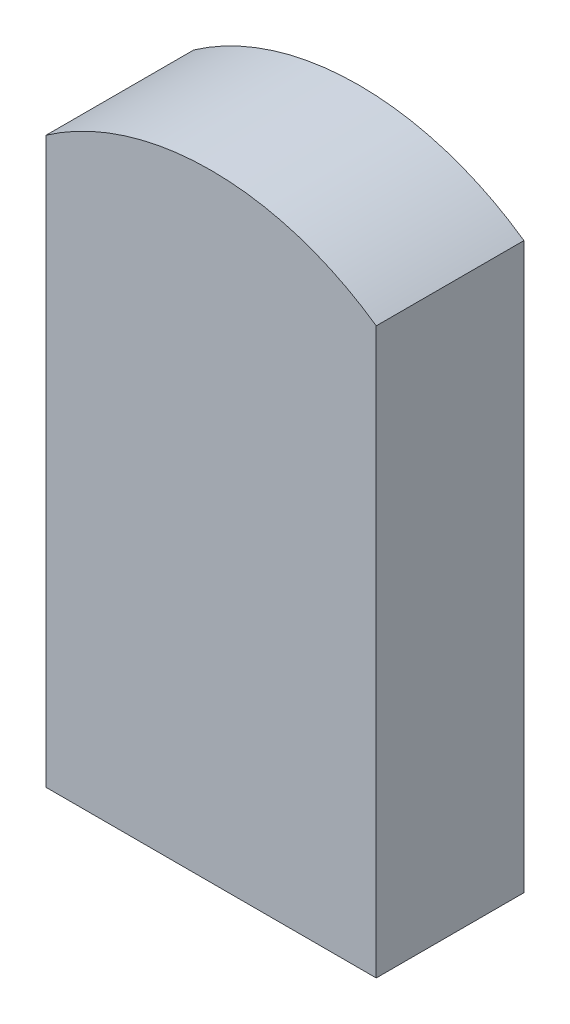
ISO-10303-21;
HEADER;
FILE_DESCRIPTION(('STEP AP214'),'2;1');
FILE_NAME('part.step','',(''),(''),'','','');
FILE_SCHEMA(('AUTOMOTIVE_DESIGN { 1 0 10303 214 1 1 1 1 }'));
ENDSEC;
DATA;
#1=APPLICATION_CONTEXT('core data for automotive mechanical design processes');
#2=APPLICATION_PROTOCOL_DEFINITION('international standard','automotive_design',2000,#1);
#3=PRODUCT_CONTEXT('',#1,'mechanical');
#4=PRODUCT('Part','Part','',(#3));
#5=PRODUCT_RELATED_PRODUCT_CATEGORY('part','',(#4));
#6=PRODUCT_DEFINITION_FORMATION('','',#4);
#7=PRODUCT_DEFINITION_CONTEXT('part definition',#1,'design');
#8=PRODUCT_DEFINITION('design','',#6,#7);
#9=PRODUCT_DEFINITION_SHAPE('','',#8);
#10=(LENGTH_UNIT() NAMED_UNIT(*) SI_UNIT(.MILLI.,.METRE.));
#11=(NAMED_UNIT(*) PLANE_ANGLE_UNIT() SI_UNIT($,.RADIAN.));
#12=(NAMED_UNIT(*) SI_UNIT($,.STERADIAN.) SOLID_ANGLE_UNIT());
#13=UNCERTAINTY_MEASURE_WITH_UNIT(LENGTH_MEASURE(1.E-05),#10,'distance_accuracy_value','');
#14=(GEOMETRIC_REPRESENTATION_CONTEXT(3) GLOBAL_UNCERTAINTY_ASSIGNED_CONTEXT((#13)) GLOBAL_UNIT_ASSIGNED_CONTEXT((#10,
#11,#12)) REPRESENTATION_CONTEXT('',''));
#15=CARTESIAN_POINT('',(0.,0.,0.));
#16=DIRECTION('',(0.,0.,1.));
#17=DIRECTION('',(1.,0.,0.));
#18=AXIS2_PLACEMENT_3D('',#15,#16,#17);
#19=CARTESIAN_POINT('',(-1.9,-3.25,0.85));
#20=DIRECTION('',(0.,-1.,0.));
#21=DIRECTION('',(0.,0.,-1.));
#22=AXIS2_PLACEMENT_3D('',#19,#20,#21);
#23=PLANE('',#22);
#24=DIRECTION('',(1.,0.,0.));
#25=VECTOR('',#24,1.);
#26=CARTESIAN_POINT('',(0.,-3.25,0.85));
#27=LINE('',#26,#25);
#28=CARTESIAN_POINT('',(-1.9,-3.25,0.85));
#29=VERTEX_POINT('',#28);
#30=CARTESIAN_POINT('',(1.9,-3.25,0.85));
#31=VERTEX_POINT('',#30);
#32=EDGE_CURVE('E84',#29,#31,#27,.T.);
#33=ORIENTED_EDGE('',*,*,#32,.F.);
#34=DIRECTION('',(0.,0.,-1.));
#35=VECTOR('',#34,1.);
#36=CARTESIAN_POINT('',(-1.9,-3.25,0.));
#37=LINE('',#36,#35);
#38=CARTESIAN_POINT('',(-1.9,-3.25,-0.85));
#39=VERTEX_POINT('',#38);
#40=EDGE_CURVE('E89',#29,#39,#37,.T.);
#41=ORIENTED_EDGE('',*,*,#40,.T.);
#42=DIRECTION('',(-1.,0.,0.));
#43=VECTOR('',#42,1.);
#44=CARTESIAN_POINT('',(0.,-3.25,-0.85));
#45=LINE('',#44,#43);
#46=CARTESIAN_POINT('',(1.9,-3.25,-0.85));
#47=VERTEX_POINT('',#46);
#48=EDGE_CURVE('E73',#47,#39,#45,.T.);
#49=ORIENTED_EDGE('',*,*,#48,.F.);
#50=DIRECTION('',(0.,0.,-1.));
#51=VECTOR('',#50,1.);
#52=CARTESIAN_POINT('',(1.9,-3.25,0.));
#53=LINE('',#52,#51);
#54=EDGE_CURVE('E60',#31,#47,#53,.T.);
#55=ORIENTED_EDGE('',*,*,#54,.F.);
#56=EDGE_LOOP('',(#33,#41,#49,#55));
#57=FACE_BOUND('',#56,.T.);
#58=ADVANCED_FACE('F15',(#57),#23,.T.);
#59=CARTESIAN_POINT('',(1.9,-3.25,0.85));
#60=DIRECTION('',(1.,0.,0.));
#61=DIRECTION('',(0.,0.,-1.));
#62=AXIS2_PLACEMENT_3D('',#59,#60,#61);
#63=PLANE('',#62);
#64=DIRECTION('',(0.,1.,0.));
#65=VECTOR('',#64,1.);
#66=CARTESIAN_POINT('',(1.9,0.3213,0.85));
#67=LINE('',#66,#65);
#68=CARTESIAN_POINT('',(1.9,3.25,0.85));
#69=VERTEX_POINT('',#68);
#70=EDGE_CURVE('E77',#31,#69,#67,.T.);
#71=ORIENTED_EDGE('',*,*,#70,.F.);
#72=ORIENTED_EDGE('',*,*,#54,.T.);
#73=DIRECTION('',(0.,-1.,0.));
#74=VECTOR('',#73,1.);
#75=CARTESIAN_POINT('',(1.9,0.3213,-0.85));
#76=LINE('',#75,#74);
#77=CARTESIAN_POINT('',(1.9,3.25,-0.85));
#78=VERTEX_POINT('',#77);
#79=EDGE_CURVE('E69',#78,#47,#76,.T.);
#80=ORIENTED_EDGE('',*,*,#79,.F.);
#81=DIRECTION('',(0.,0.,-1.));
#82=VECTOR('',#81,1.);
#83=CARTESIAN_POINT('',(1.9,3.25,0.));
#84=LINE('',#83,#82);
#85=EDGE_CURVE('E52',#69,#78,#84,.T.);
#86=ORIENTED_EDGE('',*,*,#85,.F.);
#87=EDGE_LOOP('',(#71,#72,#80,#86));
#88=FACE_BOUND('',#87,.T.);
#89=ADVANCED_FACE('F70',(#88),#63,.T.);
#90=CARTESIAN_POINT('',(0.,0.541666666666659,1.02));
#91=DIRECTION('',(0.,0.,-1.));
#92=DIRECTION('',(-1.,0.,0.));
#93=AXIS2_PLACEMENT_3D('',#90,#91,#92);
#94=CYLINDRICAL_SURFACE('',#93,3.30833333333334);
#95=CARTESIAN_POINT('',(0.,0.541666666666659,0.85));
#96=DIRECTION('',(0.,0.,1.));
#97=DIRECTION('',(1.,0.,0.));
#98=AXIS2_PLACEMENT_3D('',#95,#96,#97);
#99=CIRCLE('',#98,3.30833333333334);
#100=CARTESIAN_POINT('',(-1.9,3.25,0.85));
#101=VERTEX_POINT('',#100);
#102=EDGE_CURVE('E65',#69,#101,#99,.T.);
#103=ORIENTED_EDGE('',*,*,#102,.F.);
#104=ORIENTED_EDGE('',*,*,#85,.T.);
#105=CARTESIAN_POINT('',(0.,0.541666666666659,-0.85));
#106=DIRECTION('',(0.,0.,-1.));
#107=DIRECTION('',(-1.,0.,0.));
#108=AXIS2_PLACEMENT_3D('',#105,#106,#107);
#109=CIRCLE('',#108,3.30833333333334);
#110=CARTESIAN_POINT('',(-1.9,3.25,-0.85));
#111=VERTEX_POINT('',#110);
#112=EDGE_CURVE('E19',#111,#78,#109,.T.);
#113=ORIENTED_EDGE('',*,*,#112,.F.);
#114=DIRECTION('',(0.,0.,1.));
#115=VECTOR('',#114,1.);
#116=CARTESIAN_POINT('',(-1.9,3.25,0.));
#117=LINE('',#116,#115);
#118=EDGE_CURVE('E34',#111,#101,#117,.T.);
#119=ORIENTED_EDGE('',*,*,#118,.T.);
#120=EDGE_LOOP('',(#103,#104,#113,#119));
#121=FACE_BOUND('',#120,.T.);
#122=ADVANCED_FACE('F62',(#121),#94,.T.);
#123=CARTESIAN_POINT('',(1.9,-3.25,-0.85));
#124=DIRECTION('',(0.,0.,-1.));
#125=DIRECTION('',(-1.,0.,0.));
#126=AXIS2_PLACEMENT_3D('',#123,#124,#125);
#127=PLANE('',#126);
#128=ORIENTED_EDGE('',*,*,#79,.T.);
#129=ORIENTED_EDGE('',*,*,#48,.T.);
#130=DIRECTION('',(0.,-1.,0.));
#131=VECTOR('',#130,1.);
#132=CARTESIAN_POINT('',(-1.9,0.,-0.85));
#133=LINE('',#132,#131);
#134=EDGE_CURVE('E25',#111,#39,#133,.T.);
#135=ORIENTED_EDGE('',*,*,#134,.F.);
#136=ORIENTED_EDGE('',*,*,#112,.T.);
#137=EDGE_LOOP('',(#128,#129,#135,#136));
#138=FACE_BOUND('',#137,.T.);
#139=ADVANCED_FACE('F75',(#138),#127,.T.);
#140=CARTESIAN_POINT('',(-1.9,-3.25,0.85));
#141=DIRECTION('',(0.,0.,1.));
#142=DIRECTION('',(1.,0.,0.));
#143=AXIS2_PLACEMENT_3D('',#140,#141,#142);
#144=PLANE('',#143);
#145=ORIENTED_EDGE('',*,*,#70,.T.);
#146=ORIENTED_EDGE('',*,*,#102,.T.);
#147=DIRECTION('',(0.,1.,0.));
#148=VECTOR('',#147,1.);
#149=CARTESIAN_POINT('',(-1.9,0.,0.85));
#150=LINE('',#149,#148);
#151=EDGE_CURVE('E10',#29,#101,#150,.T.);
#152=ORIENTED_EDGE('',*,*,#151,.F.);
#153=ORIENTED_EDGE('',*,*,#32,.T.);
#154=EDGE_LOOP('',(#145,#146,#152,#153));
#155=FACE_BOUND('',#154,.T.);
#156=ADVANCED_FACE('F97',(#155),#144,.T.);
#157=CARTESIAN_POINT('',(-1.9,-3.25,-0.85));
#158=DIRECTION('',(-1.,0.,0.));
#159=DIRECTION('',(0.,0.,1.));
#160=AXIS2_PLACEMENT_3D('',#157,#158,#159);
#161=PLANE('',#160);
#162=ORIENTED_EDGE('',*,*,#151,.T.);
#163=ORIENTED_EDGE('',*,*,#118,.F.);
#164=ORIENTED_EDGE('',*,*,#134,.T.);
#165=ORIENTED_EDGE('',*,*,#40,.F.);
#166=EDGE_LOOP('',(#162,#163,#164,#165));
#167=FACE_BOUND('',#166,.T.);
#168=ADVANCED_FACE('F17',(#167),#161,.T.);
#169=CLOSED_SHELL('',(#58,#89,#122,#139,#156,#168));
#170=MANIFOLD_SOLID_BREP('B1',#169);
#171=ADVANCED_BREP_SHAPE_REPRESENTATION('',(#18,#170),#14);
#172=SHAPE_DEFINITION_REPRESENTATION(#9,#171);
ENDSEC;
END-ISO-10303-21;
